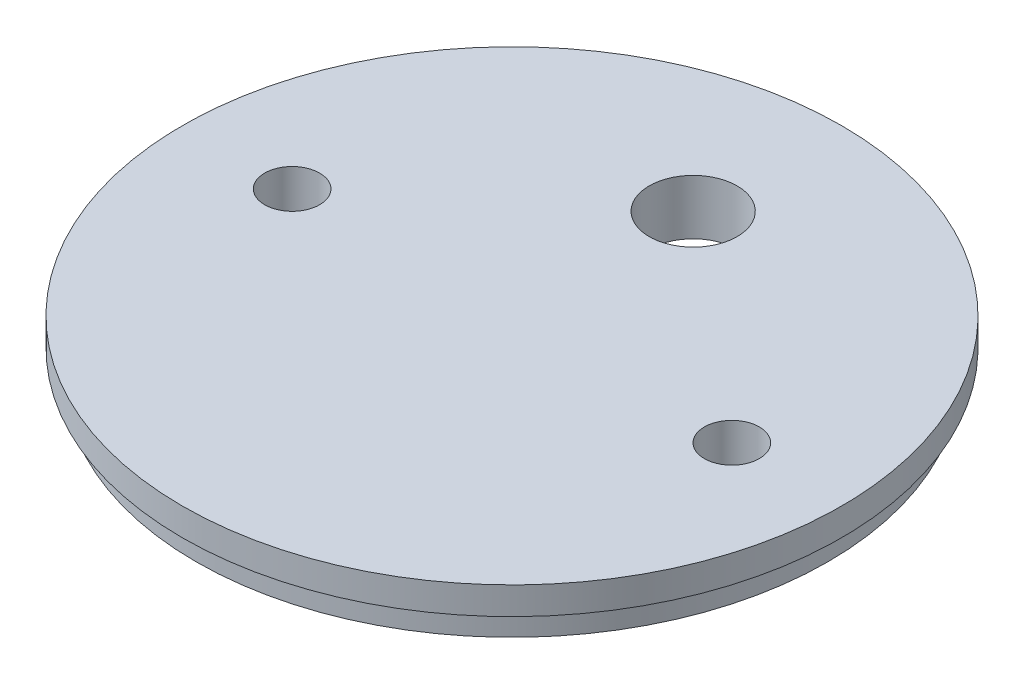
ISO-10303-21;
HEADER;
FILE_DESCRIPTION(('STEP AP214'),'2;1');
FILE_NAME('part.step','',(''),(''),'','','');
FILE_SCHEMA(('AUTOMOTIVE_DESIGN { 1 0 10303 214 1 1 1 1 }'));
ENDSEC;
DATA;
#1=APPLICATION_CONTEXT('core data for automotive mechanical design processes');
#2=APPLICATION_PROTOCOL_DEFINITION('international standard','automotive_design',2000,#1);
#3=PRODUCT_CONTEXT('',#1,'mechanical');
#4=PRODUCT('Part','Part','',(#3));
#5=PRODUCT_RELATED_PRODUCT_CATEGORY('part','',(#4));
#6=PRODUCT_DEFINITION_FORMATION('','',#4);
#7=PRODUCT_DEFINITION_CONTEXT('part definition',#1,'design');
#8=PRODUCT_DEFINITION('design','',#6,#7);
#9=PRODUCT_DEFINITION_SHAPE('','',#8);
#10=(LENGTH_UNIT() NAMED_UNIT(*) SI_UNIT(.MILLI.,.METRE.));
#11=(NAMED_UNIT(*) PLANE_ANGLE_UNIT() SI_UNIT($,.RADIAN.));
#12=(NAMED_UNIT(*) SI_UNIT($,.STERADIAN.) SOLID_ANGLE_UNIT());
#13=UNCERTAINTY_MEASURE_WITH_UNIT(LENGTH_MEASURE(1.E-05),#10,'distance_accuracy_value','');
#14=(GEOMETRIC_REPRESENTATION_CONTEXT(3) GLOBAL_UNCERTAINTY_ASSIGNED_CONTEXT((#13)) GLOBAL_UNIT_ASSIGNED_CONTEXT((#10,
#11,#12)) REPRESENTATION_CONTEXT('',''));
#15=CARTESIAN_POINT('',(0.,0.,0.));
#16=DIRECTION('',(0.,0.,1.));
#17=DIRECTION('',(1.,0.,0.));
#18=AXIS2_PLACEMENT_3D('',#15,#16,#17);
#19=CARTESIAN_POINT('',(0.,3.175,0.));
#20=DIRECTION('',(0.,-1.,0.));
#21=DIRECTION('',(0.,0.,-1.));
#22=AXIS2_PLACEMENT_3D('',#19,#20,#21);
#23=CYLINDRICAL_SURFACE('',#22,36.5125);
#24=CARTESIAN_POINT('',(0.,3.175,0.));
#25=DIRECTION('',(0.,1.,0.));
#26=DIRECTION('',(0.,0.,1.));
#27=AXIS2_PLACEMENT_3D('',#24,#25,#26);
#28=CIRCLE('',#27,36.5125);
#29=CARTESIAN_POINT('',(0.,3.175,36.5125));
#30=VERTEX_POINT('',#29);
#31=EDGE_CURVE('E10',#30,#30,#28,.T.);
#32=ORIENTED_EDGE('',*,*,#31,.F.);
#33=EDGE_LOOP('',(#32));
#34=FACE_BOUND('',#33,.T.);
#35=CARTESIAN_POINT('',(0.,0.,0.));
#36=DIRECTION('',(0.,1.,0.));
#37=DIRECTION('',(0.,0.,1.));
#38=AXIS2_PLACEMENT_3D('',#35,#36,#37);
#39=CIRCLE('',#38,36.5125);
#40=CARTESIAN_POINT('',(0.,0.,36.5125));
#41=VERTEX_POINT('',#40);
#42=EDGE_CURVE('E34',#41,#41,#39,.T.);
#43=ORIENTED_EDGE('',*,*,#42,.T.);
#44=EDGE_LOOP('',(#43));
#45=FACE_BOUND('',#44,.T.);
#46=ADVANCED_FACE('F31',(#34,#45),#23,.T.);
#47=CARTESIAN_POINT('',(0.,0.,0.));
#48=DIRECTION('',(0.,1.,0.));
#49=DIRECTION('',(0.,0.,1.));
#50=AXIS2_PLACEMENT_3D('',#47,#48,#49);
#51=PLANE('',#50);
#52=CARTESIAN_POINT('',(-25.4,0.,0.));
#53=DIRECTION('',(0.,1.,0.));
#54=DIRECTION('',(0.,0.,1.));
#55=AXIS2_PLACEMENT_3D('',#52,#53,#54);
#56=CIRCLE('',#55,3.175);
#57=CARTESIAN_POINT('',(-25.4,0.,3.175));
#58=VERTEX_POINT('',#57);
#59=EDGE_CURVE('E52',#58,#58,#56,.T.);
#60=ORIENTED_EDGE('',*,*,#59,.T.);
#61=EDGE_LOOP('',(#60));
#62=FACE_BOUND('',#61,.T.);
#63=CARTESIAN_POINT('',(25.4,0.,0.));
#64=DIRECTION('',(0.,1.,0.));
#65=DIRECTION('',(0.,0.,1.));
#66=AXIS2_PLACEMENT_3D('',#63,#64,#65);
#67=CIRCLE('',#66,3.175);
#68=CARTESIAN_POINT('',(25.4,0.,3.175));
#69=VERTEX_POINT('',#68);
#70=EDGE_CURVE('E58',#69,#69,#67,.T.);
#71=ORIENTED_EDGE('',*,*,#70,.T.);
#72=EDGE_LOOP('',(#71));
#73=FACE_BOUND('',#72,.T.);
#74=CARTESIAN_POINT('',(0.,0.,-20.9296));
#75=DIRECTION('',(0.,-1.,0.));
#76=DIRECTION('',(0.,0.,-1.));
#77=AXIS2_PLACEMENT_3D('',#74,#75,#76);
#78=CIRCLE('',#77,5.08);
#79=CARTESIAN_POINT('',(0.,0.,-26.0096));
#80=VERTEX_POINT('',#79);
#81=EDGE_CURVE('E49',#80,#80,#78,.T.);
#82=ORIENTED_EDGE('',*,*,#81,.F.);
#83=EDGE_LOOP('',(#82));
#84=FACE_BOUND('',#83,.T.);
#85=ORIENTED_EDGE('',*,*,#42,.F.);
#86=EDGE_LOOP('',(#85));
#87=FACE_BOUND('',#86,.T.);
#88=ADVANCED_FACE('F67',(#62,#73,#84,#87),#51,.F.);
#89=CARTESIAN_POINT('',(0.,6.35,0.));
#90=DIRECTION('',(0.,-1.,0.));
#91=DIRECTION('',(0.,0.,-1.));
#92=AXIS2_PLACEMENT_3D('',#89,#90,#91);
#93=CYLINDRICAL_SURFACE('',#92,38.0746);
#94=CARTESIAN_POINT('',(0.,6.35,0.));
#95=DIRECTION('',(0.,1.,0.));
#96=DIRECTION('',(0.,0.,1.));
#97=AXIS2_PLACEMENT_3D('',#94,#95,#96);
#98=CIRCLE('',#97,38.0746);
#99=CARTESIAN_POINT('',(0.,6.35,38.0746));
#100=VERTEX_POINT('',#99);
#101=EDGE_CURVE('E41',#100,#100,#98,.T.);
#102=ORIENTED_EDGE('',*,*,#101,.F.);
#103=EDGE_LOOP('',(#102));
#104=FACE_BOUND('',#103,.T.);
#105=CARTESIAN_POINT('',(0.,3.175,0.));
#106=DIRECTION('',(0.,1.,0.));
#107=DIRECTION('',(0.,0.,1.));
#108=AXIS2_PLACEMENT_3D('',#105,#106,#107);
#109=CIRCLE('',#108,38.0746);
#110=CARTESIAN_POINT('',(0.,3.175,38.0746));
#111=VERTEX_POINT('',#110);
#112=EDGE_CURVE('E43',#111,#111,#109,.T.);
#113=ORIENTED_EDGE('',*,*,#112,.T.);
#114=EDGE_LOOP('',(#113));
#115=FACE_BOUND('',#114,.T.);
#116=ADVANCED_FACE('F81',(#104,#115),#93,.T.);
#117=CARTESIAN_POINT('',(0.,6.35,0.));
#118=DIRECTION('',(0.,1.,0.));
#119=DIRECTION('',(0.,0.,1.));
#120=AXIS2_PLACEMENT_3D('',#117,#118,#119);
#121=PLANE('',#120);
#122=CARTESIAN_POINT('',(-25.4,6.35,0.));
#123=DIRECTION('',(0.,1.,0.));
#124=DIRECTION('',(0.,0.,1.));
#125=AXIS2_PLACEMENT_3D('',#122,#123,#124);
#126=CIRCLE('',#125,3.175);
#127=CARTESIAN_POINT('',(-25.4,6.35,3.175));
#128=VERTEX_POINT('',#127);
#129=EDGE_CURVE('E61',#128,#128,#126,.T.);
#130=ORIENTED_EDGE('',*,*,#129,.F.);
#131=EDGE_LOOP('',(#130));
#132=FACE_BOUND('',#131,.T.);
#133=CARTESIAN_POINT('',(25.4,6.35,0.));
#134=DIRECTION('',(0.,1.,0.));
#135=DIRECTION('',(0.,0.,1.));
#136=AXIS2_PLACEMENT_3D('',#133,#134,#135);
#137=CIRCLE('',#136,3.175);
#138=CARTESIAN_POINT('',(25.4,6.35,3.175));
#139=VERTEX_POINT('',#138);
#140=EDGE_CURVE('E55',#139,#139,#137,.T.);
#141=ORIENTED_EDGE('',*,*,#140,.F.);
#142=EDGE_LOOP('',(#141));
#143=FACE_BOUND('',#142,.T.);
#144=CARTESIAN_POINT('',(0.,6.35,-20.9296));
#145=DIRECTION('',(0.,-1.,0.));
#146=DIRECTION('',(0.,0.,-1.));
#147=AXIS2_PLACEMENT_3D('',#144,#145,#146);
#148=CIRCLE('',#147,5.08);
#149=CARTESIAN_POINT('',(0.,6.35,-26.0096));
#150=VERTEX_POINT('',#149);
#151=EDGE_CURVE('E46',#150,#150,#148,.T.);
#152=ORIENTED_EDGE('',*,*,#151,.T.);
#153=EDGE_LOOP('',(#152));
#154=FACE_BOUND('',#153,.T.);
#155=ORIENTED_EDGE('',*,*,#101,.T.);
#156=EDGE_LOOP('',(#155));
#157=FACE_BOUND('',#156,.T.);
#158=ADVANCED_FACE('F77',(#132,#143,#154,#157),#121,.T.);
#159=CARTESIAN_POINT('',(0.,3.175,0.));
#160=DIRECTION('',(0.,1.,0.));
#161=DIRECTION('',(0.,0.,1.));
#162=AXIS2_PLACEMENT_3D('',#159,#160,#161);
#163=PLANE('',#162);
#164=ORIENTED_EDGE('',*,*,#31,.T.);
#165=EDGE_LOOP('',(#164));
#166=FACE_BOUND('',#165,.T.);
#167=ORIENTED_EDGE('',*,*,#112,.F.);
#168=EDGE_LOOP('',(#167));
#169=FACE_BOUND('',#168,.T.);
#170=ADVANCED_FACE('F80',(#166,#169),#163,.F.);
#171=CARTESIAN_POINT('',(0.,6.35,-20.9296));
#172=DIRECTION('',(0.,-1.,0.));
#173=DIRECTION('',(0.,0.,-1.));
#174=AXIS2_PLACEMENT_3D('',#171,#172,#173);
#175=CYLINDRICAL_SURFACE('',#174,5.08);
#176=ORIENTED_EDGE('',*,*,#151,.F.);
#177=EDGE_LOOP('',(#176));
#178=FACE_BOUND('',#177,.T.);
#179=ORIENTED_EDGE('',*,*,#81,.T.);
#180=EDGE_LOOP('',(#179));
#181=FACE_BOUND('',#180,.T.);
#182=ADVANCED_FACE('F95',(#178,#181),#175,.F.);
#183=CARTESIAN_POINT('',(25.4,0.,0.));
#184=DIRECTION('',(0.,1.,0.));
#185=DIRECTION('',(0.,0.,1.));
#186=AXIS2_PLACEMENT_3D('',#183,#184,#185);
#187=CYLINDRICAL_SURFACE('',#186,3.175);
#188=ORIENTED_EDGE('',*,*,#70,.F.);
#189=EDGE_LOOP('',(#188));
#190=FACE_BOUND('',#189,.T.);
#191=ORIENTED_EDGE('',*,*,#140,.T.);
#192=EDGE_LOOP('',(#191));
#193=FACE_BOUND('',#192,.T.);
#194=ADVANCED_FACE('F73',(#190,#193),#187,.F.);
#195=CARTESIAN_POINT('',(-25.4,0.,0.));
#196=DIRECTION('',(0.,1.,0.));
#197=DIRECTION('',(0.,0.,1.));
#198=AXIS2_PLACEMENT_3D('',#195,#196,#197);
#199=CYLINDRICAL_SURFACE('',#198,3.175);
#200=ORIENTED_EDGE('',*,*,#59,.F.);
#201=EDGE_LOOP('',(#200));
#202=FACE_BOUND('',#201,.T.);
#203=ORIENTED_EDGE('',*,*,#129,.T.);
#204=EDGE_LOOP('',(#203));
#205=FACE_BOUND('',#204,.T.);
#206=ADVANCED_FACE('F70',(#202,#205),#199,.F.);
#207=CLOSED_SHELL('',(#46,#88,#116,#158,#170,#182,#194,#206));
#208=MANIFOLD_SOLID_BREP('B2',#207);
#209=ADVANCED_BREP_SHAPE_REPRESENTATION('',(#18,#208),#14);
#210=SHAPE_DEFINITION_REPRESENTATION(#9,#209);
ENDSEC;
END-ISO-10303-21;
